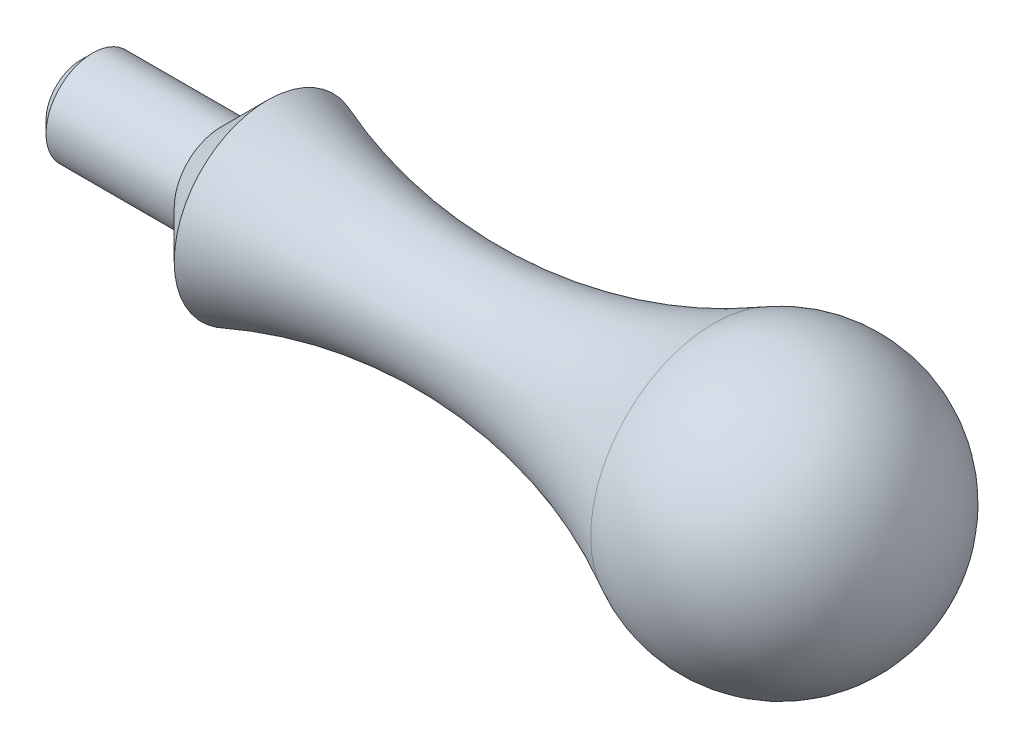
ISO-10303-21;
HEADER;
FILE_DESCRIPTION(('STEP AP214'),'2;1');
FILE_NAME('part.step','',(''),(''),'','','');
FILE_SCHEMA(('AUTOMOTIVE_DESIGN { 1 0 10303 214 1 1 1 1 }'));
ENDSEC;
DATA;
#1=APPLICATION_CONTEXT('core data for automotive mechanical design processes');
#2=APPLICATION_PROTOCOL_DEFINITION('international standard','automotive_design',2000,#1);
#3=PRODUCT_CONTEXT('',#1,'mechanical');
#4=PRODUCT('Part','Part','',(#3));
#5=PRODUCT_RELATED_PRODUCT_CATEGORY('part','',(#4));
#6=PRODUCT_DEFINITION_FORMATION('','',#4);
#7=PRODUCT_DEFINITION_CONTEXT('part definition',#1,'design');
#8=PRODUCT_DEFINITION('design','',#6,#7);
#9=PRODUCT_DEFINITION_SHAPE('','',#8);
#10=(LENGTH_UNIT() NAMED_UNIT(*) SI_UNIT(.MILLI.,.METRE.));
#11=(NAMED_UNIT(*) PLANE_ANGLE_UNIT() SI_UNIT($,.RADIAN.));
#12=(NAMED_UNIT(*) SI_UNIT($,.STERADIAN.) SOLID_ANGLE_UNIT());
#13=UNCERTAINTY_MEASURE_WITH_UNIT(LENGTH_MEASURE(1.E-05),#10,'distance_accuracy_value','');
#14=(GEOMETRIC_REPRESENTATION_CONTEXT(3) GLOBAL_UNCERTAINTY_ASSIGNED_CONTEXT((#13)) GLOBAL_UNIT_ASSIGNED_CONTEXT((#10,
#11,#12)) REPRESENTATION_CONTEXT('',''));
#15=CARTESIAN_POINT('',(0.,0.,0.));
#16=DIRECTION('',(0.,0.,1.));
#17=DIRECTION('',(1.,0.,0.));
#18=AXIS2_PLACEMENT_3D('',#15,#16,#17);
#19=CARTESIAN_POINT('',(47.625,0.,0.));
#20=DIRECTION('',(-1.,0.,0.));
#21=DIRECTION('',(0.,1.,0.));
#22=AXIS2_PLACEMENT_3D('',#19,#20,#21);
#23=SPHERICAL_SURFACE('',#22,9.52500000000001);
#24=CARTESIAN_POINT('',(43.0918570004129,0.,0.));
#25=DIRECTION('',(-1.,0.,0.));
#26=DIRECTION('',(0.,0.,1.));
#27=AXIS2_PLACEMENT_3D('',#24,#25,#26);
#28=CIRCLE('',#27,8.37712597167395);
#29=CARTESIAN_POINT('',(43.0918570004129,0.,8.37712597167395));
#30=VERTEX_POINT('',#29);
#31=EDGE_CURVE('E45',#30,#30,#28,.T.);
#32=ORIENTED_EDGE('',*,*,#31,.F.);
#33=EDGE_LOOP('',(#32));
#34=FACE_BOUND('',#33,.T.);
#35=ADVANCED_FACE('F34',(#34),#23,.T.);
#36=CARTESIAN_POINT('',(25.6824565066285,0.,0.));
#37=DIRECTION('',(-1.,0.,0.));
#38=DIRECTION('',(0.,0.,1.));
#39=AXIS2_PLACEMENT_3D('',#36,#37,#38);
#40=TOROIDAL_SURFACE('',#39,40.5492284270867,36.5804784270867);
#41=CARTESIAN_POINT('',(12.7,0.,0.));
#42=DIRECTION('',(-1.,0.,0.));
#43=DIRECTION('',(0.,0.,1.));
#44=AXIS2_PLACEMENT_3D('',#41,#42,#43);
#45=CIRCLE('',#44,6.35);
#46=CARTESIAN_POINT('',(12.7,0.,6.35));
#47=VERTEX_POINT('',#46);
#48=EDGE_CURVE('E49',#47,#47,#45,.T.);
#49=ORIENTED_EDGE('',*,*,#48,.F.);
#50=EDGE_LOOP('',(#49));
#51=FACE_BOUND('',#50,.T.);
#52=ORIENTED_EDGE('',*,*,#31,.T.);
#53=EDGE_LOOP('',(#52));
#54=FACE_BOUND('',#53,.T.);
#55=ADVANCED_FACE('F63',(#51,#54),#40,.F.);
#56=CARTESIAN_POINT('',(12.7,0.,0.));
#57=DIRECTION('',(1.,0.,0.));
#58=DIRECTION('',(0.,0.,-1.));
#59=AXIS2_PLACEMENT_3D('',#56,#57,#58);
#60=CONICAL_SURFACE('',#59,6.35,0.78539816339745);
#61=CARTESIAN_POINT('',(9.525,0.,0.));
#62=DIRECTION('',(-1.,0.,0.));
#63=DIRECTION('',(0.,0.,1.));
#64=AXIS2_PLACEMENT_3D('',#61,#62,#63);
#65=CIRCLE('',#64,3.175);
#66=CARTESIAN_POINT('',(9.525,0.,3.175));
#67=VERTEX_POINT('',#66);
#68=EDGE_CURVE('E54',#67,#67,#65,.T.);
#69=ORIENTED_EDGE('',*,*,#68,.F.);
#70=EDGE_LOOP('',(#69));
#71=FACE_BOUND('',#70,.T.);
#72=ORIENTED_EDGE('',*,*,#48,.T.);
#73=EDGE_LOOP('',(#72));
#74=FACE_BOUND('',#73,.T.);
#75=ADVANCED_FACE('F60',(#71,#74),#60,.T.);
#76=CARTESIAN_POINT('',(-4.00616050654183,0.,0.));
#77=DIRECTION('',(-1.,0.,0.));
#78=DIRECTION('',(0.,0.,1.));
#79=AXIS2_PLACEMENT_3D('',#76,#77,#78);
#80=CYLINDRICAL_SURFACE('',#79,3.175);
#81=CARTESIAN_POINT('',(0.793750000000002,0.,0.));
#82=DIRECTION('',(1.,0.,0.));
#83=DIRECTION('',(0.,0.,-1.));
#84=AXIS2_PLACEMENT_3D('',#81,#82,#83);
#85=CIRCLE('',#84,3.175);
#86=CARTESIAN_POINT('',(0.793750000000002,0.,-3.175));
#87=VERTEX_POINT('',#86);
#88=EDGE_CURVE('E10',#87,#87,#85,.T.);
#89=ORIENTED_EDGE('',*,*,#88,.T.);
#90=EDGE_LOOP('',(#89));
#91=FACE_BOUND('',#90,.T.);
#92=ORIENTED_EDGE('',*,*,#68,.T.);
#93=EDGE_LOOP('',(#92));
#94=FACE_BOUND('',#93,.T.);
#95=ADVANCED_FACE('F58',(#91,#94),#80,.T.);
#96=CARTESIAN_POINT('',(0.,0.,0.));
#97=DIRECTION('',(1.,0.,0.));
#98=DIRECTION('',(0.,0.,-1.));
#99=AXIS2_PLACEMENT_3D('',#96,#97,#98);
#100=PLANE('',#99);
#101=CARTESIAN_POINT('',(0.,0.,0.));
#102=DIRECTION('',(1.,0.,0.));
#103=DIRECTION('',(0.,0.,-1.));
#104=AXIS2_PLACEMENT_3D('',#101,#102,#103);
#105=CIRCLE('',#104,2.38124999999999);
#106=CARTESIAN_POINT('',(0.,0.,-2.38124999999999));
#107=VERTEX_POINT('',#106);
#108=EDGE_CURVE('E41',#107,#107,#105,.F.);
#109=ORIENTED_EDGE('',*,*,#108,.T.);
#110=EDGE_LOOP('',(#109));
#111=FACE_BOUND('',#110,.T.);
#112=ADVANCED_FACE('F78',(#111),#100,.F.);
#113=CARTESIAN_POINT('',(0.,0.,0.));
#114=DIRECTION('',(1.,0.,0.));
#115=DIRECTION('',(0.,0.,-1.));
#116=AXIS2_PLACEMENT_3D('',#113,#114,#115);
#117=CONICAL_SURFACE('',#116,2.38124999999999,0.785398163397451);
#118=CARTESIAN_POINT('',(0.793750000000002,0.,-3.175));
#119=CARTESIAN_POINT('',(0.785481770833335,0.,-3.16673177083333));
#120=CARTESIAN_POINT('',(0.777213541666668,0.,-3.15846354166667));
#121=CARTESIAN_POINT('',(0.760677083333335,0.,-3.14192708333333));
#122=CARTESIAN_POINT('',(0.752408854166668,0.,-3.13365885416667));
#123=CARTESIAN_POINT('',(0.735872395833335,0.,-3.11712239583333));
#124=CARTESIAN_POINT('',(0.727604166666668,0.,-3.10885416666667));
#125=CARTESIAN_POINT('',(0.711067708333335,0.,-3.09231770833333));
#126=CARTESIAN_POINT('',(0.702799479166668,0.,-3.08404947916667));
#127=CARTESIAN_POINT('',(0.686263020833335,0.,-3.06751302083333));
#128=CARTESIAN_POINT('',(0.677994791666668,0.,-3.05924479166667));
#129=CARTESIAN_POINT('',(0.661458333333335,0.,-3.04270833333333));
#130=CARTESIAN_POINT('',(0.653190104166668,0.,-3.03444010416667));
#131=CARTESIAN_POINT('',(0.636653645833335,0.,-3.01790364583333));
#132=CARTESIAN_POINT('',(0.628385416666668,0.,-3.00963541666667));
#133=CARTESIAN_POINT('',(0.611848958333335,0.,-2.99309895833333));
#134=CARTESIAN_POINT('',(0.603580729166668,0.,-2.98483072916666));
#135=CARTESIAN_POINT('',(0.587044270833335,0.,-2.96829427083333));
#136=CARTESIAN_POINT('',(0.578776041666668,0.,-2.96002604166666));
#137=CARTESIAN_POINT('',(0.562239583333335,0.,-2.94348958333333));
#138=CARTESIAN_POINT('',(0.553971354166668,0.,-2.93522135416666));
#139=CARTESIAN_POINT('',(0.537434895833334,0.,-2.91868489583333));
#140=CARTESIAN_POINT('',(0.529166666666668,0.,-2.91041666666666));
#141=CARTESIAN_POINT('',(0.512630208333335,0.,-2.89388020833333));
#142=CARTESIAN_POINT('',(0.504361979166668,0.,-2.88561197916666));
#143=CARTESIAN_POINT('',(0.487825520833334,0.,-2.86907552083333));
#144=CARTESIAN_POINT('',(0.479557291666668,0.,-2.86080729166666));
#145=CARTESIAN_POINT('',(0.463020833333334,0.,-2.84427083333333));
#146=CARTESIAN_POINT('',(0.454752604166668,0.,-2.83600260416666));
#147=CARTESIAN_POINT('',(0.438216145833334,0.,-2.81946614583333));
#148=CARTESIAN_POINT('',(0.429947916666668,0.,-2.81119791666666));
#149=CARTESIAN_POINT('',(0.413411458333334,0.,-2.79466145833333));
#150=CARTESIAN_POINT('',(0.405143229166668,0.,-2.78639322916666));
#151=CARTESIAN_POINT('',(0.388606770833334,0.,-2.76985677083333));
#152=CARTESIAN_POINT('',(0.380338541666667,0.,-2.76158854166666));
#153=CARTESIAN_POINT('',(0.363802083333334,0.,-2.74505208333333));
#154=CARTESIAN_POINT('',(0.355533854166667,0.,-2.73678385416666));
#155=CARTESIAN_POINT('',(0.338997395833334,0.,-2.72024739583333));
#156=CARTESIAN_POINT('',(0.330729166666667,0.,-2.71197916666666));
#157=CARTESIAN_POINT('',(0.314192708333334,0.,-2.69544270833333));
#158=CARTESIAN_POINT('',(0.305924479166667,0.,-2.68717447916666));
#159=CARTESIAN_POINT('',(0.289388020833334,0.,-2.67063802083333));
#160=CARTESIAN_POINT('',(0.281119791666667,0.,-2.66236979166666));
#161=CARTESIAN_POINT('',(0.264583333333334,0.,-2.64583333333333));
#162=CARTESIAN_POINT('',(0.256315104166667,0.,-2.63756510416666));
#163=CARTESIAN_POINT('',(0.239778645833334,0.,-2.62102864583333));
#164=CARTESIAN_POINT('',(0.231510416666667,0.,-2.61276041666666));
#165=CARTESIAN_POINT('',(0.214973958333334,0.,-2.59622395833333));
#166=CARTESIAN_POINT('',(0.206705729166667,0.,-2.58795572916666));
#167=CARTESIAN_POINT('',(0.190169270833334,0.,-2.57141927083333));
#168=CARTESIAN_POINT('',(0.181901041666667,0.,-2.56315104166666));
#169=CARTESIAN_POINT('',(0.165364583333334,0.,-2.54661458333333));
#170=CARTESIAN_POINT('',(0.157096354166667,0.,-2.53834635416666));
#171=CARTESIAN_POINT('',(0.140559895833334,0.,-2.52180989583333));
#172=CARTESIAN_POINT('',(0.132291666666667,0.,-2.51354166666666));
#173=CARTESIAN_POINT('',(0.115755208333334,0.,-2.49700520833333));
#174=CARTESIAN_POINT('',(0.107486979166667,0.,-2.48873697916666));
#175=CARTESIAN_POINT('',(0.0909505208333335,0.,-2.47220052083333));
#176=CARTESIAN_POINT('',(0.0826822916666669,0.,-2.46393229166666));
#177=CARTESIAN_POINT('',(0.0661458333333335,0.,-2.44739583333333));
#178=CARTESIAN_POINT('',(0.0578776041666668,0.,-2.43912760416666));
#179=CARTESIAN_POINT('',(0.0413411458333334,0.,-2.42259114583333));
#180=CARTESIAN_POINT('',(0.0330729166666668,0.,-2.41432291666666));
#181=CARTESIAN_POINT('',(0.0165364583333334,0.,-2.39778645833333));
#182=CARTESIAN_POINT('',(0.00826822916666673,0.,-2.38951822916666));
#183=CARTESIAN_POINT('',(0.,0.,-2.38124999999999));
#184=B_SPLINE_CURVE_WITH_KNOTS('',3,(#118,#119,#120,#121,#122,#123,#124,#125,#126,#127,#128,
#129,#130,#131,#132,#133,#134,#135,#136,#137,#138,#139,#140,#141,#142,#143,#144,#145,#146,#147,
#148,#149,#150,#151,#152,#153,#154,#155,#156,#157,#158,#159,#160,#161,#162,#163,#164,#165,#166,
#167,#168,#169,#170,#171,#172,#173,#174,#175,#176,#177,#178,#179,#180,#181,#182,#183),
.UNSPECIFIED.,.F.,.F.,(4,2,2,2,2,2,2,2,2,2,2,2,2,2,2,2,2,2,2,2,2,2,2,2,2,2,2,2,2,2,2,2,4),(0.,
0.0350791254729267,0.0701582509458533,0.10523737641878,0.140316501891706,0.175395627364633,
0.210474752837559,0.245553878310486,0.280633003783412,0.315712129256339,0.350791254729266,
0.385870380202192,0.420949505675119,0.456028631148045,0.491107756620972,0.526186882093898,
0.561266007566825,0.596345133039751,0.631424258512678,0.666503383985604,0.701582509458531,
0.736661634931457,0.771740760404384,0.806819885877311,0.841899011350237,0.876978136823164,
0.91205726229609,0.947136387769017,0.982215513241943,1.01729463871487,1.0523737641878,
1.08745288966072,1.12253201513365),.UNSPECIFIED.);
#185=EDGE_CURVE('BSEAM36',#87,#107,#184,.T.);
#186=ORIENTED_EDGE('',*,*,#88,.F.);
#187=ORIENTED_EDGE('',*,*,#108,.F.);
#188=ORIENTED_EDGE('',*,*,#185,.T.);
#189=ORIENTED_EDGE('',*,*,#185,.F.);
#190=EDGE_LOOP('',(#186,#188,#187,#189));
#191=FACE_BOUND('',#190,.T.);
#192=ADVANCED_FACE('F36',(#191),#117,.T.);
#193=CLOSED_SHELL('',(#35,#55,#75,#95,#112,#192));
#194=MANIFOLD_SOLID_BREP('B2',#193);
#195=ADVANCED_BREP_SHAPE_REPRESENTATION('',(#18,#194),#14);
#196=SHAPE_DEFINITION_REPRESENTATION(#9,#195);
ENDSEC;
END-ISO-10303-21;
